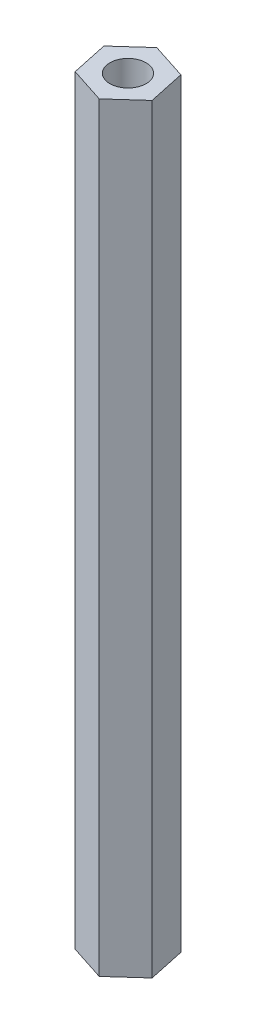
ISO-10303-21;
HEADER;
FILE_DESCRIPTION(('STEP AP214'),'2;1');
FILE_NAME('part.step','',(''),(''),'','','');
FILE_SCHEMA(('AUTOMOTIVE_DESIGN { 1 0 10303 214 1 1 1 1 }'));
ENDSEC;
DATA;
#1=APPLICATION_CONTEXT('core data for automotive mechanical design processes');
#2=APPLICATION_PROTOCOL_DEFINITION('international standard','automotive_design',2000,#1);
#3=PRODUCT_CONTEXT('',#1,'mechanical');
#4=PRODUCT('Part','Part','',(#3));
#5=PRODUCT_RELATED_PRODUCT_CATEGORY('part','',(#4));
#6=PRODUCT_DEFINITION_FORMATION('','',#4);
#7=PRODUCT_DEFINITION_CONTEXT('part definition',#1,'design');
#8=PRODUCT_DEFINITION('design','',#6,#7);
#9=PRODUCT_DEFINITION_SHAPE('','',#8);
#10=(LENGTH_UNIT() NAMED_UNIT(*) SI_UNIT(.MILLI.,.METRE.));
#11=(NAMED_UNIT(*) PLANE_ANGLE_UNIT() SI_UNIT($,.RADIAN.));
#12=(NAMED_UNIT(*) SI_UNIT($,.STERADIAN.) SOLID_ANGLE_UNIT());
#13=UNCERTAINTY_MEASURE_WITH_UNIT(LENGTH_MEASURE(1.E-05),#10,'distance_accuracy_value','');
#14=(GEOMETRIC_REPRESENTATION_CONTEXT(3) GLOBAL_UNCERTAINTY_ASSIGNED_CONTEXT((#13)) GLOBAL_UNIT_ASSIGNED_CONTEXT((#10,
#11,#12)) REPRESENTATION_CONTEXT('',''));
#15=CARTESIAN_POINT('',(0.,0.,0.));
#16=DIRECTION('',(0.,0.,1.));
#17=DIRECTION('',(1.,0.,0.));
#18=AXIS2_PLACEMENT_3D('',#15,#16,#17);
#19=CARTESIAN_POINT('',(0.679103002545253,66.,3.17825724445554));
#20=DIRECTION('',(-0.66992279206715,0.,-0.742430772980858));
#21=DIRECTION('',(-0.742430772980858,0.,0.66992279206715));
#22=AXIS2_PLACEMENT_3D('',#19,#20,#21);
#23=PLANE('',#22);
#24=DIRECTION('',(0.742430772980858,0.,-0.66992279206715));
#25=VECTOR('',#24,1.);
#26=CARTESIAN_POINT('',(0.679103002545253,0.,3.17825724445554));
#27=LINE('',#26,#25);
#28=CARTESIAN_POINT('',(0.679103002545253,0.,3.17825724445554));
#29=VERTEX_POINT('',#28);
#30=CARTESIAN_POINT('',(3.09200301473305,0.,1.00100817023729));
#31=VERTEX_POINT('',#30);
#32=EDGE_CURVE('E128',#29,#31,#27,.T.);
#33=ORIENTED_EDGE('',*,*,#32,.T.);
#34=DIRECTION('',(0.,-1.,0.));
#35=VECTOR('',#34,1.);
#36=CARTESIAN_POINT('',(3.09200301473305,66.,1.00100817023729));
#37=LINE('',#36,#35);
#38=CARTESIAN_POINT('',(3.09200301473305,66.,1.00100817023729));
#39=VERTEX_POINT('',#38);
#40=EDGE_CURVE('E11',#39,#31,#37,.T.);
#41=ORIENTED_EDGE('',*,*,#40,.F.);
#42=DIRECTION('',(0.742430772980858,0.,-0.66992279206715));
#43=VECTOR('',#42,1.);
#44=CARTESIAN_POINT('',(0.679103002545253,66.,3.17825724445554));
#45=LINE('',#44,#43);
#46=CARTESIAN_POINT('',(0.679103002545253,66.,3.17825724445554));
#47=VERTEX_POINT('',#46);
#48=EDGE_CURVE('E139',#47,#39,#45,.T.);
#49=ORIENTED_EDGE('',*,*,#48,.F.);
#50=DIRECTION('',(0.,-1.,0.));
#51=VECTOR('',#50,1.);
#52=CARTESIAN_POINT('',(0.679103002545253,66.,3.17825724445554));
#53=LINE('',#52,#51);
#54=EDGE_CURVE('E124',#47,#29,#53,.T.);
#55=ORIENTED_EDGE('',*,*,#54,.T.);
#56=EDGE_LOOP('',(#33,#41,#49,#55));
#57=FACE_BOUND('',#56,.T.);
#58=ADVANCED_FACE('F41',(#57),#23,.F.);
#59=CARTESIAN_POINT('',(3.09200301473305,66.,1.00100817023729));
#60=DIRECTION('',(-0.977925305986315,0.,0.208954770013924));
#61=DIRECTION('',(0.208954770013924,0.,0.977925305986315));
#62=AXIS2_PLACEMENT_3D('',#59,#60,#61);
#63=PLANE('',#62);
#64=DIRECTION('',(-0.208954770013924,0.,-0.977925305986315));
#65=VECTOR('',#64,1.);
#66=CARTESIAN_POINT('',(3.09200301473305,0.,1.00100817023729));
#67=LINE('',#66,#65);
#68=CARTESIAN_POINT('',(2.41290001218779,0.,-2.17724907421825));
#69=VERTEX_POINT('',#68);
#70=EDGE_CURVE('E131',#31,#69,#67,.T.);
#71=ORIENTED_EDGE('',*,*,#70,.T.);
#72=DIRECTION('',(0.,-1.,0.));
#73=VECTOR('',#72,1.);
#74=CARTESIAN_POINT('',(2.41290001218779,66.,-2.17724907421825));
#75=LINE('',#74,#73);
#76=CARTESIAN_POINT('',(2.41290001218779,66.,-2.17724907421825));
#77=VERTEX_POINT('',#76);
#78=EDGE_CURVE('E49',#77,#69,#75,.T.);
#79=ORIENTED_EDGE('',*,*,#78,.F.);
#80=DIRECTION('',(-0.208954770013924,0.,-0.977925305986315));
#81=VECTOR('',#80,1.);
#82=CARTESIAN_POINT('',(3.09200301473305,66.,1.00100817023729));
#83=LINE('',#82,#81);
#84=EDGE_CURVE('E95',#39,#77,#83,.T.);
#85=ORIENTED_EDGE('',*,*,#84,.F.);
#86=ORIENTED_EDGE('',*,*,#40,.T.);
#87=EDGE_LOOP('',(#71,#79,#85,#86));
#88=FACE_BOUND('',#87,.T.);
#89=ADVANCED_FACE('F164',(#88),#63,.F.);
#90=CARTESIAN_POINT('',(2.41290001218779,66.,-2.17724907421825));
#91=DIRECTION('',(-0.308002513919165,0.,0.951385542994781));
#92=DIRECTION('',(0.951385542994781,0.,0.308002513919165));
#93=AXIS2_PLACEMENT_3D('',#90,#91,#92);
#94=PLANE('',#93);
#95=DIRECTION('',(-0.951385542994781,0.,-0.308002513919165));
#96=VECTOR('',#95,1.);
#97=CARTESIAN_POINT('',(2.41290001218779,0.,-2.17724907421825));
#98=LINE('',#97,#96);
#99=CARTESIAN_POINT('',(-0.679103002545253,0.,-3.17825724445554));
#100=VERTEX_POINT('',#99);
#101=EDGE_CURVE('E134',#69,#100,#98,.T.);
#102=ORIENTED_EDGE('',*,*,#101,.T.);
#103=DIRECTION('',(0.,-1.,0.));
#104=VECTOR('',#103,1.);
#105=CARTESIAN_POINT('',(-0.679103002545253,66.,-3.17825724445554));
#106=LINE('',#105,#104);
#107=CARTESIAN_POINT('',(-0.679103002545253,66.,-3.17825724445554));
#108=VERTEX_POINT('',#107);
#109=EDGE_CURVE('E119',#108,#100,#106,.T.);
#110=ORIENTED_EDGE('',*,*,#109,.F.);
#111=DIRECTION('',(-0.951385542994781,0.,-0.308002513919165));
#112=VECTOR('',#111,1.);
#113=CARTESIAN_POINT('',(2.41290001218779,66.,-2.17724907421825));
#114=LINE('',#113,#112);
#115=EDGE_CURVE('E110',#77,#108,#114,.T.);
#116=ORIENTED_EDGE('',*,*,#115,.F.);
#117=ORIENTED_EDGE('',*,*,#78,.T.);
#118=EDGE_LOOP('',(#102,#110,#116,#117));
#119=FACE_BOUND('',#118,.T.);
#120=ADVANCED_FACE('F145',(#119),#94,.F.);
#121=CARTESIAN_POINT('',(-0.679103002545253,66.,-3.17825724445554));
#122=DIRECTION('',(0.66992279206715,0.,0.742430772980857));
#123=DIRECTION('',(0.742430772980857,0.,-0.66992279206715));
#124=AXIS2_PLACEMENT_3D('',#121,#122,#123);
#125=PLANE('',#124);
#126=DIRECTION('',(-0.742430772980857,0.,0.66992279206715));
#127=VECTOR('',#126,1.);
#128=CARTESIAN_POINT('',(-0.679103002545253,0.,-3.17825724445554));
#129=LINE('',#128,#127);
#130=CARTESIAN_POINT('',(-3.09200301473305,0.,-1.00100817023729));
#131=VERTEX_POINT('',#130);
#132=EDGE_CURVE('E118',#100,#131,#129,.T.);
#133=ORIENTED_EDGE('',*,*,#132,.T.);
#134=DIRECTION('',(0.,-1.,0.));
#135=VECTOR('',#134,1.);
#136=CARTESIAN_POINT('',(-3.09200301473305,66.,-1.00100817023729));
#137=LINE('',#136,#135);
#138=CARTESIAN_POINT('',(-3.09200301473305,66.,-1.00100817023729));
#139=VERTEX_POINT('',#138);
#140=EDGE_CURVE('E115',#139,#131,#137,.T.);
#141=ORIENTED_EDGE('',*,*,#140,.F.);
#142=DIRECTION('',(-0.742430772980857,0.,0.66992279206715));
#143=VECTOR('',#142,1.);
#144=CARTESIAN_POINT('',(-0.679103002545253,66.,-3.17825724445554));
#145=LINE('',#144,#143);
#146=EDGE_CURVE('E104',#108,#139,#145,.T.);
#147=ORIENTED_EDGE('',*,*,#146,.F.);
#148=ORIENTED_EDGE('',*,*,#109,.T.);
#149=EDGE_LOOP('',(#133,#141,#147,#148));
#150=FACE_BOUND('',#149,.T.);
#151=ADVANCED_FACE('F116',(#150),#125,.F.);
#152=CARTESIAN_POINT('',(-3.09200301473305,66.,-1.00100817023729));
#153=DIRECTION('',(0.977925305986315,0.,-0.208954770013923));
#154=DIRECTION('',(-0.208954770013923,0.,-0.977925305986315));
#155=AXIS2_PLACEMENT_3D('',#152,#153,#154);
#156=PLANE('',#155);
#157=DIRECTION('',(0.208954770013923,0.,0.977925305986315));
#158=VECTOR('',#157,1.);
#159=CARTESIAN_POINT('',(-3.09200301473305,0.,-1.00100817023729));
#160=LINE('',#159,#158);
#161=CARTESIAN_POINT('',(-2.4129000121878,0.,2.17724907421825));
#162=VERTEX_POINT('',#161);
#163=EDGE_CURVE('E81',#131,#162,#160,.T.);
#164=ORIENTED_EDGE('',*,*,#163,.T.);
#165=DIRECTION('',(0.,-1.,0.));
#166=VECTOR('',#165,1.);
#167=CARTESIAN_POINT('',(-2.4129000121878,66.,2.17724907421825));
#168=LINE('',#167,#166);
#169=CARTESIAN_POINT('',(-2.4129000121878,66.,2.17724907421825));
#170=VERTEX_POINT('',#169);
#171=EDGE_CURVE('E120',#170,#162,#168,.T.);
#172=ORIENTED_EDGE('',*,*,#171,.F.);
#173=DIRECTION('',(0.208954770013923,0.,0.977925305986315));
#174=VECTOR('',#173,1.);
#175=CARTESIAN_POINT('',(-3.09200301473305,66.,-1.00100817023729));
#176=LINE('',#175,#174);
#177=EDGE_CURVE('E108',#139,#170,#176,.T.);
#178=ORIENTED_EDGE('',*,*,#177,.F.);
#179=ORIENTED_EDGE('',*,*,#140,.T.);
#180=EDGE_LOOP('',(#164,#172,#178,#179));
#181=FACE_BOUND('',#180,.T.);
#182=ADVANCED_FACE('F122',(#181),#156,.F.);
#183=CARTESIAN_POINT('',(-2.4129000121878,66.,2.17724907421825));
#184=DIRECTION('',(0.308002513919165,0.,-0.951385542994781));
#185=DIRECTION('',(-0.951385542994781,0.,-0.308002513919165));
#186=AXIS2_PLACEMENT_3D('',#183,#184,#185);
#187=PLANE('',#186);
#188=DIRECTION('',(0.951385542994781,0.,0.308002513919165));
#189=VECTOR('',#188,1.);
#190=CARTESIAN_POINT('',(-2.4129000121878,0.,2.17724907421825));
#191=LINE('',#190,#189);
#192=EDGE_CURVE('E87',#162,#29,#191,.T.);
#193=ORIENTED_EDGE('',*,*,#192,.T.);
#194=ORIENTED_EDGE('',*,*,#54,.F.);
#195=DIRECTION('',(0.951385542994781,0.,0.308002513919165));
#196=VECTOR('',#195,1.);
#197=CARTESIAN_POINT('',(-2.4129000121878,66.,2.17724907421825));
#198=LINE('',#197,#196);
#199=EDGE_CURVE('E57',#170,#47,#198,.T.);
#200=ORIENTED_EDGE('',*,*,#199,.F.);
#201=ORIENTED_EDGE('',*,*,#171,.T.);
#202=EDGE_LOOP('',(#193,#194,#200,#201));
#203=FACE_BOUND('',#202,.T.);
#204=ADVANCED_FACE('F152',(#203),#187,.F.);
#205=CARTESIAN_POINT('',(0.,66.,0.));
#206=DIRECTION('',(0.,1.,0.));
#207=DIRECTION('',(0.,0.,1.));
#208=AXIS2_PLACEMENT_3D('',#205,#206,#207);
#209=PLANE('',#208);
#210=CARTESIAN_POINT('',(0.,66.,0.));
#211=DIRECTION('',(0.,1.,0.));
#212=DIRECTION('',(0.,0.,1.));
#213=AXIS2_PLACEMENT_3D('',#210,#211,#212);
#214=CIRCLE('',#213,1.57499999999999);
#215=CARTESIAN_POINT('',(0.,66.,1.57499999999999));
#216=VERTEX_POINT('',#215);
#217=EDGE_CURVE('E306',#216,#216,#214,.T.);
#218=ORIENTED_EDGE('',*,*,#217,.F.);
#219=EDGE_LOOP('',(#218));
#220=FACE_BOUND('',#219,.T.);
#221=ORIENTED_EDGE('',*,*,#48,.T.);
#222=ORIENTED_EDGE('',*,*,#84,.T.);
#223=ORIENTED_EDGE('',*,*,#115,.T.);
#224=ORIENTED_EDGE('',*,*,#146,.T.);
#225=ORIENTED_EDGE('',*,*,#177,.T.);
#226=ORIENTED_EDGE('',*,*,#199,.T.);
#227=EDGE_LOOP('',(#221,#222,#223,#224,#225,#226));
#228=FACE_BOUND('',#227,.T.);
#229=ADVANCED_FACE('F106',(#220,#228),#209,.T.);
#230=CARTESIAN_POINT('',(0.,0.,0.));
#231=DIRECTION('',(0.,1.,0.));
#232=DIRECTION('',(0.,0.,1.));
#233=AXIS2_PLACEMENT_3D('',#230,#231,#232);
#234=PLANE('',#233);
#235=CARTESIAN_POINT('',(0.,0.,0.));
#236=DIRECTION('',(0.,-1.,0.));
#237=DIRECTION('',(0.,0.,-1.));
#238=AXIS2_PLACEMENT_3D('',#235,#236,#237);
#239=CIRCLE('',#238,1.57499999999999);
#240=CARTESIAN_POINT('',(0.,0.,-1.57499999999999));
#241=VERTEX_POINT('',#240);
#242=EDGE_CURVE('E308',#241,#241,#239,.T.);
#243=ORIENTED_EDGE('',*,*,#242,.F.);
#244=EDGE_LOOP('',(#243));
#245=FACE_BOUND('',#244,.T.);
#246=ORIENTED_EDGE('',*,*,#32,.F.);
#247=ORIENTED_EDGE('',*,*,#192,.F.);
#248=ORIENTED_EDGE('',*,*,#163,.F.);
#249=ORIENTED_EDGE('',*,*,#132,.F.);
#250=ORIENTED_EDGE('',*,*,#101,.F.);
#251=ORIENTED_EDGE('',*,*,#70,.F.);
#252=EDGE_LOOP('',(#246,#247,#248,#249,#250,#251));
#253=FACE_BOUND('',#252,.T.);
#254=ADVANCED_FACE('F148',(#245,#253),#234,.F.);
#255=CARTESIAN_POINT('',(0.,10.,0.));
#256=DIRECTION('',(0.,-1.,0.));
#257=DIRECTION('',(0.,0.,-1.));
#258=AXIS2_PLACEMENT_3D('',#255,#256,#257);
#259=CONICAL_SURFACE('',#258,1.575,1.02974425867665);
#260=CARTESIAN_POINT('',(0.,10.9463554749684,0.));
#261=VERTEX_POINT('',#260);
#262=VERTEX_LOOP('',#261);
#263=FACE_BOUND('',#262,.T.);
#264=CARTESIAN_POINT('',(0.,10.,0.));
#265=DIRECTION('',(0.,-1.,0.));
#266=DIRECTION('',(0.,0.,-1.));
#267=AXIS2_PLACEMENT_3D('',#264,#265,#266);
#268=CIRCLE('',#267,1.575);
#269=CARTESIAN_POINT('',(0.,10.,-1.575));
#270=VERTEX_POINT('',#269);
#271=EDGE_CURVE('E132',#270,#270,#268,.T.);
#272=ORIENTED_EDGE('',*,*,#271,.T.);
#273=EDGE_LOOP('',(#272));
#274=FACE_BOUND('',#273,.T.);
#275=ADVANCED_FACE('F199',(#263,#274),#259,.F.);
#276=CARTESIAN_POINT('',(0.,0.,0.));
#277=DIRECTION('',(0.,-1.,0.));
#278=DIRECTION('',(0.,0.,-1.));
#279=AXIS2_PLACEMENT_3D('',#276,#277,#278);
#280=CYLINDRICAL_SURFACE('',#279,1.57499999999999);
#281=ORIENTED_EDGE('',*,*,#271,.F.);
#282=EDGE_LOOP('',(#281));
#283=FACE_BOUND('',#282,.T.);
#284=ORIENTED_EDGE('',*,*,#242,.T.);
#285=EDGE_LOOP('',(#284));
#286=FACE_BOUND('',#285,.T.);
#287=ADVANCED_FACE('F211',(#283,#286),#280,.F.);
#288=CARTESIAN_POINT('',(0.,56.,0.));
#289=DIRECTION('',(0.,1.,0.));
#290=DIRECTION('',(0.,0.,1.));
#291=AXIS2_PLACEMENT_3D('',#288,#289,#290);
#292=CONICAL_SURFACE('',#291,1.57499999999999,1.02974425867665);
#293=CARTESIAN_POINT('',(0.,55.0536445250316,0.));
#294=VERTEX_POINT('',#293);
#295=VERTEX_LOOP('',#294);
#296=FACE_BOUND('',#295,.T.);
#297=CARTESIAN_POINT('',(0.,56.,0.));
#298=DIRECTION('',(0.,1.,0.));
#299=DIRECTION('',(0.,0.,1.));
#300=AXIS2_PLACEMENT_3D('',#297,#298,#299);
#301=CIRCLE('',#300,1.57499999999999);
#302=CARTESIAN_POINT('',(0.,56.,1.57499999999999));
#303=VERTEX_POINT('',#302);
#304=EDGE_CURVE('E303',#303,#303,#301,.T.);
#305=ORIENTED_EDGE('',*,*,#304,.T.);
#306=EDGE_LOOP('',(#305));
#307=FACE_BOUND('',#306,.T.);
#308=ADVANCED_FACE('F223',(#296,#307),#292,.F.);
#309=CARTESIAN_POINT('',(0.,66.,0.));
#310=DIRECTION('',(0.,1.,0.));
#311=DIRECTION('',(0.,0.,1.));
#312=AXIS2_PLACEMENT_3D('',#309,#310,#311);
#313=CYLINDRICAL_SURFACE('',#312,1.57499999999999);
#314=ORIENTED_EDGE('',*,*,#304,.F.);
#315=EDGE_LOOP('',(#314));
#316=FACE_BOUND('',#315,.T.);
#317=ORIENTED_EDGE('',*,*,#217,.T.);
#318=EDGE_LOOP('',(#317));
#319=FACE_BOUND('',#318,.T.);
#320=ADVANCED_FACE('F244',(#316,#319),#313,.F.);
#321=CLOSED_SHELL('',(#58,#89,#120,#151,#182,#204,#229,#254,#275,#287,#308,#320));
#322=MANIFOLD_SOLID_BREP('B2',#321);
#323=ADVANCED_BREP_SHAPE_REPRESENTATION('',(#18,#322),#14);
#324=SHAPE_DEFINITION_REPRESENTATION(#9,#323);
ENDSEC;
END-ISO-10303-21;
